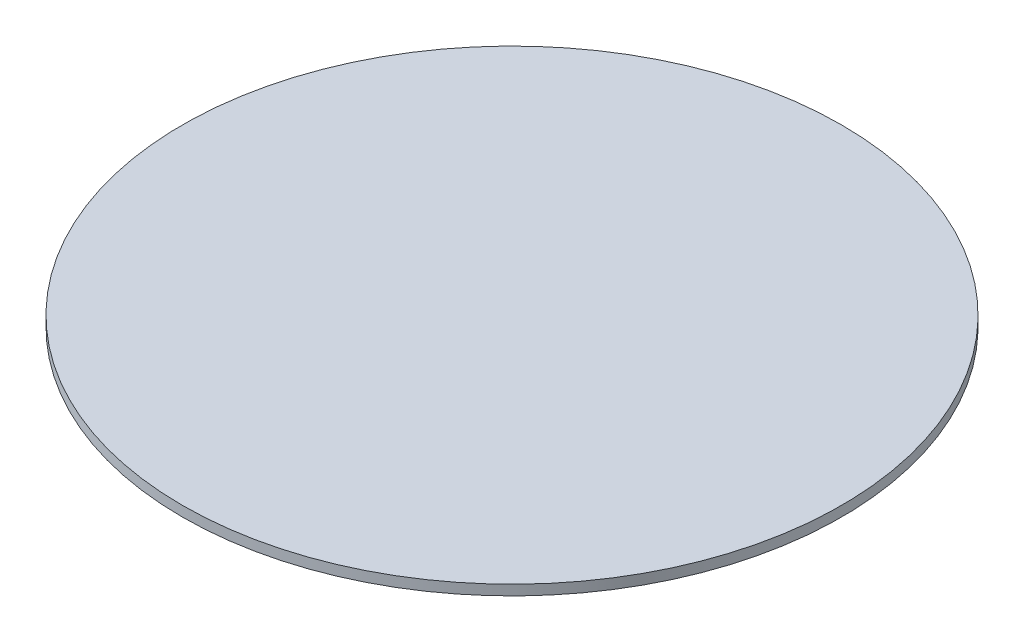
ISO-10303-21;
HEADER;
FILE_DESCRIPTION(('STEP AP214'),'2;1');
FILE_NAME('part.step','',(''),(''),'','','');
FILE_SCHEMA(('AUTOMOTIVE_DESIGN { 1 0 10303 214 1 1 1 1 }'));
ENDSEC;
DATA;
#1=APPLICATION_CONTEXT('core data for automotive mechanical design processes');
#2=APPLICATION_PROTOCOL_DEFINITION('international standard','automotive_design',2000,#1);
#3=PRODUCT_CONTEXT('',#1,'mechanical');
#4=PRODUCT('Part','Part','',(#3));
#5=PRODUCT_RELATED_PRODUCT_CATEGORY('part','',(#4));
#6=PRODUCT_DEFINITION_FORMATION('','',#4);
#7=PRODUCT_DEFINITION_CONTEXT('part definition',#1,'design');
#8=PRODUCT_DEFINITION('design','',#6,#7);
#9=PRODUCT_DEFINITION_SHAPE('','',#8);
#10=(LENGTH_UNIT() NAMED_UNIT(*) SI_UNIT(.MILLI.,.METRE.));
#11=(NAMED_UNIT(*) PLANE_ANGLE_UNIT() SI_UNIT($,.RADIAN.));
#12=(NAMED_UNIT(*) SI_UNIT($,.STERADIAN.) SOLID_ANGLE_UNIT());
#13=UNCERTAINTY_MEASURE_WITH_UNIT(LENGTH_MEASURE(1.E-05),#10,'distance_accuracy_value','');
#14=(GEOMETRIC_REPRESENTATION_CONTEXT(3) GLOBAL_UNCERTAINTY_ASSIGNED_CONTEXT((#13)) GLOBAL_UNIT_ASSIGNED_CONTEXT((#10,
#11,#12)) REPRESENTATION_CONTEXT('',''));
#15=CARTESIAN_POINT('',(0.,0.,0.));
#16=DIRECTION('',(0.,0.,1.));
#17=DIRECTION('',(1.,0.,0.));
#18=AXIS2_PLACEMENT_3D('',#15,#16,#17);
#19=CARTESIAN_POINT('',(0.,1.59,0.));
#20=DIRECTION('',(0.,-1.,0.));
#21=DIRECTION('',(0.,0.,-1.));
#22=AXIS2_PLACEMENT_3D('',#19,#20,#21);
#23=CYLINDRICAL_SURFACE('',#22,51.562);
#24=CARTESIAN_POINT('',(0.,1.59,0.));
#25=DIRECTION('',(0.,1.,0.));
#26=DIRECTION('',(0.,0.,1.));
#27=AXIS2_PLACEMENT_3D('',#24,#25,#26);
#28=CIRCLE('',#27,51.562);
#29=CARTESIAN_POINT('',(0.,1.59,-51.562));
#30=VERTEX_POINT('',#29);
#31=EDGE_CURVE('E10',#30,#30,#28,.T.);
#32=CARTESIAN_POINT('',(0.,0.,0.));
#33=DIRECTION('',(0.,1.,0.));
#34=DIRECTION('',(0.,0.,1.));
#35=AXIS2_PLACEMENT_3D('',#32,#33,#34);
#36=CIRCLE('',#35,51.562);
#37=CARTESIAN_POINT('',(0.,0.,-51.562));
#38=VERTEX_POINT('',#37);
#39=EDGE_CURVE('E35',#38,#38,#36,.T.);
#40=CARTESIAN_POINT('',(0.,1.59,-51.562));
#41=CARTESIAN_POINT('',(0.,1.5734375,-51.562));
#42=CARTESIAN_POINT('',(0.,1.556875,-51.562));
#43=CARTESIAN_POINT('',(0.,1.52375,-51.562));
#44=CARTESIAN_POINT('',(0.,1.5071875,-51.562));
#45=CARTESIAN_POINT('',(0.,1.4740625,-51.562));
#46=CARTESIAN_POINT('',(0.,1.4575,-51.562));
#47=CARTESIAN_POINT('',(0.,1.424375,-51.562));
#48=CARTESIAN_POINT('',(0.,1.4078125,-51.562));
#49=CARTESIAN_POINT('',(0.,1.3746875,-51.562));
#50=CARTESIAN_POINT('',(0.,1.358125,-51.562));
#51=CARTESIAN_POINT('',(0.,1.325,-51.562));
#52=CARTESIAN_POINT('',(0.,1.3084375,-51.562));
#53=CARTESIAN_POINT('',(0.,1.2753125,-51.562));
#54=CARTESIAN_POINT('',(0.,1.25875,-51.562));
#55=CARTESIAN_POINT('',(0.,1.225625,-51.562));
#56=CARTESIAN_POINT('',(0.,1.2090625,-51.562));
#57=CARTESIAN_POINT('',(0.,1.1759375,-51.562));
#58=CARTESIAN_POINT('',(0.,1.159375,-51.562));
#59=CARTESIAN_POINT('',(0.,1.12625,-51.562));
#60=CARTESIAN_POINT('',(0.,1.1096875,-51.562));
#61=CARTESIAN_POINT('',(0.,1.0765625,-51.562));
#62=CARTESIAN_POINT('',(0.,1.06,-51.562));
#63=CARTESIAN_POINT('',(0.,1.026875,-51.562));
#64=CARTESIAN_POINT('',(0.,1.0103125,-51.562));
#65=CARTESIAN_POINT('',(0.,0.9771875,-51.562));
#66=CARTESIAN_POINT('',(0.,0.960625,-51.562));
#67=CARTESIAN_POINT('',(0.,0.9275,-51.562));
#68=CARTESIAN_POINT('',(0.,0.9109375,-51.562));
#69=CARTESIAN_POINT('',(0.,0.8778125,-51.562));
#70=CARTESIAN_POINT('',(0.,0.86125,-51.562));
#71=CARTESIAN_POINT('',(0.,0.828125,-51.562));
#72=CARTESIAN_POINT('',(0.,0.8115625,-51.562));
#73=CARTESIAN_POINT('',(0.,0.7784375,-51.562));
#74=CARTESIAN_POINT('',(0.,0.761875,-51.562));
#75=CARTESIAN_POINT('',(0.,0.72875,-51.562));
#76=CARTESIAN_POINT('',(0.,0.7121875,-51.562));
#77=CARTESIAN_POINT('',(0.,0.6790625,-51.562));
#78=CARTESIAN_POINT('',(0.,0.6625,-51.562));
#79=CARTESIAN_POINT('',(0.,0.629375,-51.562));
#80=CARTESIAN_POINT('',(0.,0.6128125,-51.562));
#81=CARTESIAN_POINT('',(0.,0.5796875,-51.562));
#82=CARTESIAN_POINT('',(0.,0.563125,-51.562));
#83=CARTESIAN_POINT('',(0.,0.53,-51.562));
#84=CARTESIAN_POINT('',(0.,0.5134375,-51.562));
#85=CARTESIAN_POINT('',(0.,0.4803125,-51.562));
#86=CARTESIAN_POINT('',(0.,0.46375,-51.562));
#87=CARTESIAN_POINT('',(0.,0.430625,-51.562));
#88=CARTESIAN_POINT('',(0.,0.4140625,-51.562));
#89=CARTESIAN_POINT('',(0.,0.3809375,-51.562));
#90=CARTESIAN_POINT('',(0.,0.364375,-51.562));
#91=CARTESIAN_POINT('',(0.,0.33125,-51.562));
#92=CARTESIAN_POINT('',(0.,0.3146875,-51.562));
#93=CARTESIAN_POINT('',(0.,0.2815625,-51.562));
#94=CARTESIAN_POINT('',(0.,0.265,-51.562));
#95=CARTESIAN_POINT('',(0.,0.231875,-51.562));
#96=CARTESIAN_POINT('',(0.,0.2153125,-51.562));
#97=CARTESIAN_POINT('',(0.,0.1821875,-51.562));
#98=CARTESIAN_POINT('',(0.,0.165625,-51.562));
#99=CARTESIAN_POINT('',(0.,0.1325,-51.562));
#100=CARTESIAN_POINT('',(0.,0.1159375,-51.562));
#101=CARTESIAN_POINT('',(0.,0.0828125000000001,-51.562));
#102=CARTESIAN_POINT('',(0.,0.06625,-51.562));
#103=CARTESIAN_POINT('',(0.,0.033125,-51.562));
#104=CARTESIAN_POINT('',(0.,0.0165625,-51.562));
#105=CARTESIAN_POINT('',(0.,0.,-51.562));
#106=B_SPLINE_CURVE_WITH_KNOTS('',3,(#40,#41,#42,#43,#44,#45,#46,#47,#48,#49,#50,#51,#52,#53,
#54,#55,#56,#57,#58,#59,#60,#61,#62,#63,#64,#65,#66,#67,#68,#69,#70,#71,#72,#73,#74,#75,#76,#77,
#78,#79,#80,#81,#82,#83,#84,#85,#86,#87,#88,#89,#90,#91,#92,#93,#94,#95,#96,#97,#98,#99,#100,
#101,#102,#103,#104,#105),.UNSPECIFIED.,.F.,.F.,(4,2,2,2,2,2,2,2,2,2,2,2,2,2,2,2,2,2,2,2,2,2,2,
2,2,2,2,2,2,2,2,2,4),(0.,0.0496875,0.0993750000000001,0.1490625,0.19875,0.2484375,0.298125,
0.3478125,0.3975,0.4471875,0.496875,0.5465625,0.59625,0.6459375,0.695625,0.7453125,0.795,
0.8446875,0.894375,0.9440625,0.99375,1.0434375,1.093125,1.1428125,1.1925,1.2421875,1.291875,
1.3415625,1.39125,1.4409375,1.490625,1.5403125,1.59),.UNSPECIFIED.);
#107=EDGE_CURVE('BSEAM32',#30,#38,#106,.T.);
#108=ORIENTED_EDGE('',*,*,#31,.F.);
#109=ORIENTED_EDGE('',*,*,#39,.T.);
#110=ORIENTED_EDGE('',*,*,#107,.T.);
#111=ORIENTED_EDGE('',*,*,#107,.F.);
#112=EDGE_LOOP('',(#108,#110,#109,#111));
#113=FACE_BOUND('',#112,.T.);
#114=ADVANCED_FACE('F32',(#113),#23,.T.);
#115=CARTESIAN_POINT('',(0.,1.59,0.));
#116=DIRECTION('',(0.,1.,0.));
#117=DIRECTION('',(0.,0.,1.));
#118=AXIS2_PLACEMENT_3D('',#115,#116,#117);
#119=PLANE('',#118);
#120=ORIENTED_EDGE('',*,*,#31,.T.);
#121=EDGE_LOOP('',(#120));
#122=FACE_BOUND('',#121,.T.);
#123=ADVANCED_FACE('F47',(#122),#119,.T.);
#124=CARTESIAN_POINT('',(0.,0.,0.));
#125=DIRECTION('',(0.,1.,0.));
#126=DIRECTION('',(0.,0.,1.));
#127=AXIS2_PLACEMENT_3D('',#124,#125,#126);
#128=PLANE('',#127);
#129=ORIENTED_EDGE('',*,*,#39,.F.);
#130=EDGE_LOOP('',(#129));
#131=FACE_BOUND('',#130,.T.);
#132=ADVANCED_FACE('F45',(#131),#128,.F.);
#133=CLOSED_SHELL('',(#114,#123,#132));
#134=MANIFOLD_SOLID_BREP('B2',#133);
#135=ADVANCED_BREP_SHAPE_REPRESENTATION('',(#18,#134),#14);
#136=SHAPE_DEFINITION_REPRESENTATION(#9,#135);
ENDSEC;
END-ISO-10303-21;
